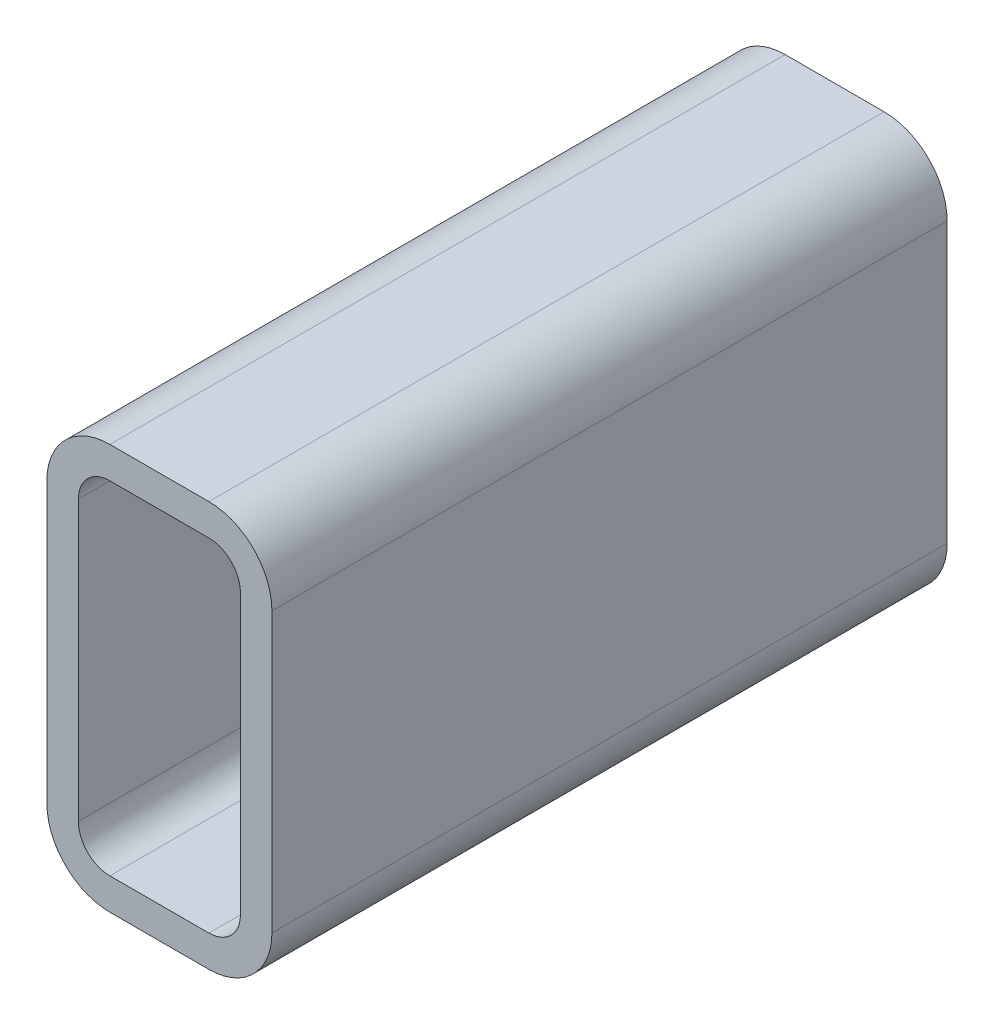
ISO-10303-21;
HEADER;
FILE_DESCRIPTION(('STEP AP214'),'2;1');
FILE_NAME('part.step','',(''),(''),'','','');
FILE_SCHEMA(('AUTOMOTIVE_DESIGN { 1 0 10303 214 1 1 1 1 }'));
ENDSEC;
DATA;
#1=APPLICATION_CONTEXT('core data for automotive mechanical design processes');
#2=APPLICATION_PROTOCOL_DEFINITION('international standard','automotive_design',2000,#1);
#3=PRODUCT_CONTEXT('',#1,'mechanical');
#4=PRODUCT('Part','Part','',(#3));
#5=PRODUCT_RELATED_PRODUCT_CATEGORY('part','',(#4));
#6=PRODUCT_DEFINITION_FORMATION('','',#4);
#7=PRODUCT_DEFINITION_CONTEXT('part definition',#1,'design');
#8=PRODUCT_DEFINITION('design','',#6,#7);
#9=PRODUCT_DEFINITION_SHAPE('','',#8);
#10=(LENGTH_UNIT() NAMED_UNIT(*) SI_UNIT(.MILLI.,.METRE.));
#11=(NAMED_UNIT(*) PLANE_ANGLE_UNIT() SI_UNIT($,.RADIAN.));
#12=(NAMED_UNIT(*) SI_UNIT($,.STERADIAN.) SOLID_ANGLE_UNIT());
#13=UNCERTAINTY_MEASURE_WITH_UNIT(LENGTH_MEASURE(1.E-05),#10,'distance_accuracy_value','');
#14=(GEOMETRIC_REPRESENTATION_CONTEXT(3) GLOBAL_UNCERTAINTY_ASSIGNED_CONTEXT((#13)) GLOBAL_UNIT_ASSIGNED_CONTEXT((#10,
#11,#12)) REPRESENTATION_CONTEXT('',''));
#15=CARTESIAN_POINT('',(0.,0.,0.));
#16=DIRECTION('',(0.,0.,1.));
#17=DIRECTION('',(1.,0.,0.));
#18=AXIS2_PLACEMENT_3D('',#15,#16,#17);
#19=CARTESIAN_POINT('',(-50.,-90.,300.));
#20=DIRECTION('',(0.,0.,1.));
#21=DIRECTION('',(1.,0.,0.));
#22=AXIS2_PLACEMENT_3D('',#19,#20,#21);
#23=PLANE('',#22);
#24=DIRECTION('',(0.,-1.,0.));
#25=VECTOR('',#24,1.);
#26=CARTESIAN_POINT('',(-50.,90.,300.));
#27=LINE('',#26,#25);
#28=CARTESIAN_POINT('',(-50.,62.,300.));
#29=VERTEX_POINT('',#28);
#30=CARTESIAN_POINT('',(-50.,-61.9999999999999,300.));
#31=VERTEX_POINT('',#30);
#32=EDGE_CURVE('E247',#29,#31,#27,.T.);
#33=ORIENTED_EDGE('',*,*,#32,.T.);
#34=CARTESIAN_POINT('',(-22.,-62.,300.));
#35=DIRECTION('',(0.,0.,1.));
#36=DIRECTION('',(1.,0.,0.));
#37=AXIS2_PLACEMENT_3D('',#34,#35,#36);
#38=CIRCLE('',#37,28.);
#39=CARTESIAN_POINT('',(-22.,-90.,300.));
#40=VERTEX_POINT('',#39);
#41=EDGE_CURVE('E231',#31,#40,#38,.T.);
#42=ORIENTED_EDGE('',*,*,#41,.T.);
#43=DIRECTION('',(1.,0.,0.));
#44=VECTOR('',#43,1.);
#45=CARTESIAN_POINT('',(-50.,-90.,300.));
#46=LINE('',#45,#44);
#47=CARTESIAN_POINT('',(22.,-90.,300.));
#48=VERTEX_POINT('',#47);
#49=EDGE_CURVE('E250',#40,#48,#46,.T.);
#50=ORIENTED_EDGE('',*,*,#49,.T.);
#51=CARTESIAN_POINT('',(22.,-62.,300.));
#52=DIRECTION('',(0.,0.,1.));
#53=DIRECTION('',(1.,0.,0.));
#54=AXIS2_PLACEMENT_3D('',#51,#52,#53);
#55=CIRCLE('',#54,28.);
#56=CARTESIAN_POINT('',(50.,-61.9999999999999,300.));
#57=VERTEX_POINT('',#56);
#58=EDGE_CURVE('E229',#48,#57,#55,.T.);
#59=ORIENTED_EDGE('',*,*,#58,.T.);
#60=DIRECTION('',(0.,1.,0.));
#61=VECTOR('',#60,1.);
#62=CARTESIAN_POINT('',(50.,90.,300.));
#63=LINE('',#62,#61);
#64=CARTESIAN_POINT('',(50.,62.,300.));
#65=VERTEX_POINT('',#64);
#66=EDGE_CURVE('E177',#57,#65,#63,.T.);
#67=ORIENTED_EDGE('',*,*,#66,.T.);
#68=CARTESIAN_POINT('',(22.,62.,300.));
#69=DIRECTION('',(0.,0.,1.));
#70=DIRECTION('',(1.,0.,0.));
#71=AXIS2_PLACEMENT_3D('',#68,#69,#70);
#72=CIRCLE('',#71,28.);
#73=CARTESIAN_POINT('',(22.,90.,300.));
#74=VERTEX_POINT('',#73);
#75=EDGE_CURVE('E55',#65,#74,#72,.T.);
#76=ORIENTED_EDGE('',*,*,#75,.T.);
#77=DIRECTION('',(-1.,0.,0.));
#78=VECTOR('',#77,1.);
#79=CARTESIAN_POINT('',(-50.,90.,300.));
#80=LINE('',#79,#78);
#81=CARTESIAN_POINT('',(-22.,90.,300.));
#82=VERTEX_POINT('',#81);
#83=EDGE_CURVE('E173',#74,#82,#80,.T.);
#84=ORIENTED_EDGE('',*,*,#83,.T.);
#85=CARTESIAN_POINT('',(-22.,62.,300.));
#86=DIRECTION('',(0.,0.,1.));
#87=DIRECTION('',(1.,0.,0.));
#88=AXIS2_PLACEMENT_3D('',#85,#86,#87);
#89=CIRCLE('',#88,28.);
#90=EDGE_CURVE('E227',#82,#29,#89,.T.);
#91=ORIENTED_EDGE('',*,*,#90,.T.);
#92=EDGE_LOOP('',(#33,#42,#50,#59,#67,#76,#84,#91));
#93=FACE_BOUND('',#92,.T.);
#94=DIRECTION('',(1.,0.,0.));
#95=VECTOR('',#94,1.);
#96=CARTESIAN_POINT('',(-36.,-76.,300.));
#97=LINE('',#96,#95);
#98=CARTESIAN_POINT('',(-22.,-76.,300.));
#99=VERTEX_POINT('',#98);
#100=CARTESIAN_POINT('',(22.,-76.,300.));
#101=VERTEX_POINT('',#100);
#102=EDGE_CURVE('E277',#99,#101,#97,.T.);
#103=ORIENTED_EDGE('',*,*,#102,.F.);
#104=CARTESIAN_POINT('',(-22.,-62.,300.));
#105=DIRECTION('',(0.,0.,1.));
#106=DIRECTION('',(1.,0.,0.));
#107=AXIS2_PLACEMENT_3D('',#104,#105,#106);
#108=CIRCLE('',#107,14.);
#109=CARTESIAN_POINT('',(-36.,-62.,300.));
#110=VERTEX_POINT('',#109);
#111=EDGE_CURVE('E159',#99,#110,#108,.F.);
#112=ORIENTED_EDGE('',*,*,#111,.T.);
#113=DIRECTION('',(0.,-1.,0.));
#114=VECTOR('',#113,1.);
#115=CARTESIAN_POINT('',(-36.,76.,300.));
#116=LINE('',#115,#114);
#117=CARTESIAN_POINT('',(-36.,62.,300.));
#118=VERTEX_POINT('',#117);
#119=EDGE_CURVE('E266',#118,#110,#116,.T.);
#120=ORIENTED_EDGE('',*,*,#119,.F.);
#121=CARTESIAN_POINT('',(-22.,62.,300.));
#122=DIRECTION('',(0.,0.,1.));
#123=DIRECTION('',(1.,0.,0.));
#124=AXIS2_PLACEMENT_3D('',#121,#122,#123);
#125=CIRCLE('',#124,14.);
#126=CARTESIAN_POINT('',(-22.,76.,300.));
#127=VERTEX_POINT('',#126);
#128=EDGE_CURVE('E158',#118,#127,#125,.F.);
#129=ORIENTED_EDGE('',*,*,#128,.T.);
#130=DIRECTION('',(-1.,0.,0.));
#131=VECTOR('',#130,1.);
#132=CARTESIAN_POINT('',(-36.,76.,300.));
#133=LINE('',#132,#131);
#134=CARTESIAN_POINT('',(22.,76.,300.));
#135=VERTEX_POINT('',#134);
#136=EDGE_CURVE('E260',#135,#127,#133,.T.);
#137=ORIENTED_EDGE('',*,*,#136,.F.);
#138=CARTESIAN_POINT('',(22.,62.,300.));
#139=DIRECTION('',(0.,0.,1.));
#140=DIRECTION('',(1.,0.,0.));
#141=AXIS2_PLACEMENT_3D('',#138,#139,#140);
#142=CIRCLE('',#141,14.);
#143=CARTESIAN_POINT('',(36.,62.,300.));
#144=VERTEX_POINT('',#143);
#145=EDGE_CURVE('E202',#135,#144,#142,.F.);
#146=ORIENTED_EDGE('',*,*,#145,.T.);
#147=DIRECTION('',(0.,1.,0.));
#148=VECTOR('',#147,1.);
#149=CARTESIAN_POINT('',(36.,76.,300.));
#150=LINE('',#149,#148);
#151=CARTESIAN_POINT('',(36.,-62.,300.));
#152=VERTEX_POINT('',#151);
#153=EDGE_CURVE('E274',#152,#144,#150,.T.);
#154=ORIENTED_EDGE('',*,*,#153,.F.);
#155=CARTESIAN_POINT('',(22.,-62.,300.));
#156=DIRECTION('',(0.,0.,1.));
#157=DIRECTION('',(1.,0.,0.));
#158=AXIS2_PLACEMENT_3D('',#155,#156,#157);
#159=CIRCLE('',#158,14.);
#160=EDGE_CURVE('E206',#152,#101,#159,.F.);
#161=ORIENTED_EDGE('',*,*,#160,.T.);
#162=EDGE_LOOP('',(#103,#112,#120,#129,#137,#146,#154,#161));
#163=FACE_BOUND('',#162,.T.);
#164=ADVANCED_FACE('F35',(#93,#163),#23,.T.);
#165=CARTESIAN_POINT('',(-50.,-90.,0.));
#166=DIRECTION('',(0.,0.,1.));
#167=DIRECTION('',(1.,0.,0.));
#168=AXIS2_PLACEMENT_3D('',#165,#166,#167);
#169=PLANE('',#168);
#170=DIRECTION('',(1.,0.,0.));
#171=VECTOR('',#170,1.);
#172=CARTESIAN_POINT('',(-50.,-90.,0.));
#173=LINE('',#172,#171);
#174=CARTESIAN_POINT('',(-22.,-90.,0.));
#175=VERTEX_POINT('',#174);
#176=CARTESIAN_POINT('',(22.,-90.,0.));
#177=VERTEX_POINT('',#176);
#178=EDGE_CURVE('E252',#175,#177,#173,.T.);
#179=ORIENTED_EDGE('',*,*,#178,.F.);
#180=CARTESIAN_POINT('',(-22.,-62.,0.));
#181=DIRECTION('',(0.,0.,1.));
#182=DIRECTION('',(1.,0.,0.));
#183=AXIS2_PLACEMENT_3D('',#180,#181,#182);
#184=CIRCLE('',#183,28.);
#185=CARTESIAN_POINT('',(-50.,-61.9999999999999,0.));
#186=VERTEX_POINT('',#185);
#187=EDGE_CURVE('E219',#175,#186,#184,.F.);
#188=ORIENTED_EDGE('',*,*,#187,.T.);
#189=DIRECTION('',(0.,-1.,0.));
#190=VECTOR('',#189,1.);
#191=CARTESIAN_POINT('',(-50.,90.,0.));
#192=LINE('',#191,#190);
#193=CARTESIAN_POINT('',(-50.,62.,0.));
#194=VERTEX_POINT('',#193);
#195=EDGE_CURVE('E256',#194,#186,#192,.T.);
#196=ORIENTED_EDGE('',*,*,#195,.F.);
#197=CARTESIAN_POINT('',(-22.,62.,0.));
#198=DIRECTION('',(0.,0.,1.));
#199=DIRECTION('',(1.,0.,0.));
#200=AXIS2_PLACEMENT_3D('',#197,#198,#199);
#201=CIRCLE('',#200,28.);
#202=CARTESIAN_POINT('',(-22.,90.,0.));
#203=VERTEX_POINT('',#202);
#204=EDGE_CURVE('E215',#194,#203,#201,.F.);
#205=ORIENTED_EDGE('',*,*,#204,.T.);
#206=DIRECTION('',(-1.,0.,0.));
#207=VECTOR('',#206,1.);
#208=CARTESIAN_POINT('',(-50.,90.,0.));
#209=LINE('',#208,#207);
#210=CARTESIAN_POINT('',(22.,90.,0.));
#211=VERTEX_POINT('',#210);
#212=EDGE_CURVE('E180',#211,#203,#209,.T.);
#213=ORIENTED_EDGE('',*,*,#212,.F.);
#214=CARTESIAN_POINT('',(22.,62.,0.));
#215=DIRECTION('',(0.,0.,1.));
#216=DIRECTION('',(1.,0.,0.));
#217=AXIS2_PLACEMENT_3D('',#214,#215,#216);
#218=CIRCLE('',#217,28.);
#219=CARTESIAN_POINT('',(50.,62.,0.));
#220=VERTEX_POINT('',#219);
#221=EDGE_CURVE('E213',#211,#220,#218,.F.);
#222=ORIENTED_EDGE('',*,*,#221,.T.);
#223=DIRECTION('',(0.,1.,0.));
#224=VECTOR('',#223,1.);
#225=CARTESIAN_POINT('',(50.,90.,0.));
#226=LINE('',#225,#224);
#227=CARTESIAN_POINT('',(50.,-61.9999999999999,0.));
#228=VERTEX_POINT('',#227);
#229=EDGE_CURVE('E248',#228,#220,#226,.T.);
#230=ORIENTED_EDGE('',*,*,#229,.F.);
#231=CARTESIAN_POINT('',(22.,-62.,0.));
#232=DIRECTION('',(0.,0.,1.));
#233=DIRECTION('',(1.,0.,0.));
#234=AXIS2_PLACEMENT_3D('',#231,#232,#233);
#235=CIRCLE('',#234,28.);
#236=EDGE_CURVE('E217',#228,#177,#235,.F.);
#237=ORIENTED_EDGE('',*,*,#236,.T.);
#238=EDGE_LOOP('',(#179,#188,#196,#205,#213,#222,#230,#237));
#239=FACE_BOUND('',#238,.T.);
#240=DIRECTION('',(-1.,0.,0.));
#241=VECTOR('',#240,1.);
#242=CARTESIAN_POINT('',(-36.,76.,0.));
#243=LINE('',#242,#241);
#244=CARTESIAN_POINT('',(22.,76.,0.));
#245=VERTEX_POINT('',#244);
#246=CARTESIAN_POINT('',(-22.,76.,0.));
#247=VERTEX_POINT('',#246);
#248=EDGE_CURVE('E153',#245,#247,#243,.T.);
#249=ORIENTED_EDGE('',*,*,#248,.T.);
#250=CARTESIAN_POINT('',(-22.,62.,0.));
#251=DIRECTION('',(0.,0.,1.));
#252=DIRECTION('',(1.,0.,0.));
#253=AXIS2_PLACEMENT_3D('',#250,#251,#252);
#254=CIRCLE('',#253,14.);
#255=CARTESIAN_POINT('',(-36.,62.,0.));
#256=VERTEX_POINT('',#255);
#257=EDGE_CURVE('E148',#247,#256,#254,.T.);
#258=ORIENTED_EDGE('',*,*,#257,.T.);
#259=DIRECTION('',(0.,-1.,0.));
#260=VECTOR('',#259,1.);
#261=CARTESIAN_POINT('',(-36.,76.,0.));
#262=LINE('',#261,#260);
#263=CARTESIAN_POINT('',(-36.,-62.,0.));
#264=VERTEX_POINT('',#263);
#265=EDGE_CURVE('E151',#256,#264,#262,.T.);
#266=ORIENTED_EDGE('',*,*,#265,.T.);
#267=CARTESIAN_POINT('',(-22.,-62.,0.));
#268=DIRECTION('',(0.,0.,1.));
#269=DIRECTION('',(1.,0.,0.));
#270=AXIS2_PLACEMENT_3D('',#267,#268,#269);
#271=CIRCLE('',#270,14.);
#272=CARTESIAN_POINT('',(-22.,-76.,0.));
#273=VERTEX_POINT('',#272);
#274=EDGE_CURVE('E196',#264,#273,#271,.T.);
#275=ORIENTED_EDGE('',*,*,#274,.T.);
#276=DIRECTION('',(1.,0.,0.));
#277=VECTOR('',#276,1.);
#278=CARTESIAN_POINT('',(-36.,-76.,0.));
#279=LINE('',#278,#277);
#280=CARTESIAN_POINT('',(22.,-76.,0.));
#281=VERTEX_POINT('',#280);
#282=EDGE_CURVE('E169',#273,#281,#279,.T.);
#283=ORIENTED_EDGE('',*,*,#282,.T.);
#284=CARTESIAN_POINT('',(22.,-62.,0.));
#285=DIRECTION('',(0.,0.,1.));
#286=DIRECTION('',(1.,0.,0.));
#287=AXIS2_PLACEMENT_3D('',#284,#285,#286);
#288=CIRCLE('',#287,14.);
#289=CARTESIAN_POINT('',(36.,-62.,0.));
#290=VERTEX_POINT('',#289);
#291=EDGE_CURVE('E204',#281,#290,#288,.T.);
#292=ORIENTED_EDGE('',*,*,#291,.T.);
#293=DIRECTION('',(0.,1.,0.));
#294=VECTOR('',#293,1.);
#295=CARTESIAN_POINT('',(36.,76.,0.));
#296=LINE('',#295,#294);
#297=CARTESIAN_POINT('',(36.,62.,0.));
#298=VERTEX_POINT('',#297);
#299=EDGE_CURVE('E267',#290,#298,#296,.T.);
#300=ORIENTED_EDGE('',*,*,#299,.T.);
#301=CARTESIAN_POINT('',(22.,62.,0.));
#302=DIRECTION('',(0.,0.,1.));
#303=DIRECTION('',(1.,0.,0.));
#304=AXIS2_PLACEMENT_3D('',#301,#302,#303);
#305=CIRCLE('',#304,14.);
#306=EDGE_CURVE('E200',#298,#245,#305,.T.);
#307=ORIENTED_EDGE('',*,*,#306,.T.);
#308=EDGE_LOOP('',(#249,#258,#266,#275,#283,#292,#300,#307));
#309=FACE_BOUND('',#308,.T.);
#310=ADVANCED_FACE('F150',(#239,#309),#169,.F.);
#311=CARTESIAN_POINT('',(-50.,90.,300.));
#312=DIRECTION('',(1.,0.,0.));
#313=DIRECTION('',(0.,1.,0.));
#314=AXIS2_PLACEMENT_3D('',#311,#312,#313);
#315=PLANE('',#314);
#316=ORIENTED_EDGE('',*,*,#195,.T.);
#317=DIRECTION('',(0.,0.,-1.));
#318=VECTOR('',#317,1.);
#319=CARTESIAN_POINT('',(-50.,-62.,300.));
#320=LINE('',#319,#318);
#321=EDGE_CURVE('E224',#186,#31,#320,.F.);
#322=ORIENTED_EDGE('',*,*,#321,.T.);
#323=ORIENTED_EDGE('',*,*,#32,.F.);
#324=DIRECTION('',(0.,0.,-1.));
#325=VECTOR('',#324,1.);
#326=CARTESIAN_POINT('',(-50.,62.,300.));
#327=LINE('',#326,#325);
#328=EDGE_CURVE('E221',#29,#194,#327,.T.);
#329=ORIENTED_EDGE('',*,*,#328,.T.);
#330=EDGE_LOOP('',(#316,#322,#323,#329));
#331=FACE_BOUND('',#330,.T.);
#332=ADVANCED_FACE('F311',(#331),#315,.F.);
#333=CARTESIAN_POINT('',(-50.,-90.,300.));
#334=DIRECTION('',(0.,1.,0.));
#335=DIRECTION('',(0.,0.,1.));
#336=AXIS2_PLACEMENT_3D('',#333,#334,#335);
#337=PLANE('',#336);
#338=ORIENTED_EDGE('',*,*,#49,.F.);
#339=DIRECTION('',(0.,0.,-1.));
#340=VECTOR('',#339,1.);
#341=CARTESIAN_POINT('',(-22.,-90.,300.));
#342=LINE('',#341,#340);
#343=EDGE_CURVE('E210',#40,#175,#342,.T.);
#344=ORIENTED_EDGE('',*,*,#343,.T.);
#345=ORIENTED_EDGE('',*,*,#178,.T.);
#346=DIRECTION('',(0.,0.,-1.));
#347=VECTOR('',#346,1.);
#348=CARTESIAN_POINT('',(22.,-90.,300.));
#349=LINE('',#348,#347);
#350=EDGE_CURVE('E208',#177,#48,#349,.F.);
#351=ORIENTED_EDGE('',*,*,#350,.T.);
#352=EDGE_LOOP('',(#338,#344,#345,#351));
#353=FACE_BOUND('',#352,.T.);
#354=ADVANCED_FACE('F321',(#353),#337,.F.);
#355=CARTESIAN_POINT('',(50.,90.,300.));
#356=DIRECTION('',(-1.,0.,0.));
#357=DIRECTION('',(0.,0.,1.));
#358=AXIS2_PLACEMENT_3D('',#355,#356,#357);
#359=PLANE('',#358);
#360=ORIENTED_EDGE('',*,*,#66,.F.);
#361=DIRECTION('',(0.,0.,-1.));
#362=VECTOR('',#361,1.);
#363=CARTESIAN_POINT('',(50.,-62.,300.));
#364=LINE('',#363,#362);
#365=EDGE_CURVE('E235',#57,#228,#364,.T.);
#366=ORIENTED_EDGE('',*,*,#365,.T.);
#367=ORIENTED_EDGE('',*,*,#229,.T.);
#368=DIRECTION('',(0.,0.,-1.));
#369=VECTOR('',#368,1.);
#370=CARTESIAN_POINT('',(50.,62.,300.));
#371=LINE('',#370,#369);
#372=EDGE_CURVE('E233',#220,#65,#371,.F.);
#373=ORIENTED_EDGE('',*,*,#372,.T.);
#374=EDGE_LOOP('',(#360,#366,#367,#373));
#375=FACE_BOUND('',#374,.T.);
#376=ADVANCED_FACE('F318',(#375),#359,.F.);
#377=CARTESIAN_POINT('',(-50.,90.,300.));
#378=DIRECTION('',(0.,-1.,0.));
#379=DIRECTION('',(0.,0.,-1.));
#380=AXIS2_PLACEMENT_3D('',#377,#378,#379);
#381=PLANE('',#380);
#382=ORIENTED_EDGE('',*,*,#212,.T.);
#383=DIRECTION('',(0.,0.,-1.));
#384=VECTOR('',#383,1.);
#385=CARTESIAN_POINT('',(-22.,90.,300.));
#386=LINE('',#385,#384);
#387=EDGE_CURVE('E11',#203,#82,#386,.F.);
#388=ORIENTED_EDGE('',*,*,#387,.T.);
#389=ORIENTED_EDGE('',*,*,#83,.F.);
#390=DIRECTION('',(0.,0.,-1.));
#391=VECTOR('',#390,1.);
#392=CARTESIAN_POINT('',(22.,90.,300.));
#393=LINE('',#392,#391);
#394=EDGE_CURVE('E43',#74,#211,#393,.T.);
#395=ORIENTED_EDGE('',*,*,#394,.T.);
#396=EDGE_LOOP('',(#382,#388,#389,#395));
#397=FACE_BOUND('',#396,.T.);
#398=ADVANCED_FACE('F240',(#397),#381,.F.);
#399=CARTESIAN_POINT('',(-36.,76.,300.));
#400=DIRECTION('',(1.,0.,0.));
#401=DIRECTION('',(0.,0.,-1.));
#402=AXIS2_PLACEMENT_3D('',#399,#400,#401);
#403=PLANE('',#402);
#404=ORIENTED_EDGE('',*,*,#119,.T.);
#405=DIRECTION('',(0.,0.,-1.));
#406=VECTOR('',#405,1.);
#407=CARTESIAN_POINT('',(-36.,-62.,0.));
#408=LINE('',#407,#406);
#409=EDGE_CURVE('E168',#110,#264,#408,.T.);
#410=ORIENTED_EDGE('',*,*,#409,.T.);
#411=ORIENTED_EDGE('',*,*,#265,.F.);
#412=DIRECTION('',(0.,0.,-1.));
#413=VECTOR('',#412,1.);
#414=CARTESIAN_POINT('',(-36.,62.,300.));
#415=LINE('',#414,#413);
#416=EDGE_CURVE('E165',#256,#118,#415,.F.);
#417=ORIENTED_EDGE('',*,*,#416,.T.);
#418=EDGE_LOOP('',(#404,#410,#411,#417));
#419=FACE_BOUND('',#418,.T.);
#420=ADVANCED_FACE('F164',(#419),#403,.T.);
#421=CARTESIAN_POINT('',(-36.,-76.,300.));
#422=DIRECTION('',(0.,1.,0.));
#423=DIRECTION('',(0.,0.,1.));
#424=AXIS2_PLACEMENT_3D('',#421,#422,#423);
#425=PLANE('',#424);
#426=ORIENTED_EDGE('',*,*,#282,.F.);
#427=DIRECTION('',(0.,0.,-1.));
#428=VECTOR('',#427,1.);
#429=CARTESIAN_POINT('',(-22.,-76.,300.));
#430=LINE('',#429,#428);
#431=EDGE_CURVE('E185',#273,#99,#430,.F.);
#432=ORIENTED_EDGE('',*,*,#431,.T.);
#433=ORIENTED_EDGE('',*,*,#102,.T.);
#434=DIRECTION('',(0.,0.,-1.));
#435=VECTOR('',#434,1.);
#436=CARTESIAN_POINT('',(22.,-76.,0.));
#437=LINE('',#436,#435);
#438=EDGE_CURVE('E175',#101,#281,#437,.T.);
#439=ORIENTED_EDGE('',*,*,#438,.T.);
#440=EDGE_LOOP('',(#426,#432,#433,#439));
#441=FACE_BOUND('',#440,.T.);
#442=ADVANCED_FACE('F287',(#441),#425,.T.);
#443=CARTESIAN_POINT('',(36.,76.,300.));
#444=DIRECTION('',(-1.,0.,0.));
#445=DIRECTION('',(0.,0.,1.));
#446=AXIS2_PLACEMENT_3D('',#443,#444,#445);
#447=PLANE('',#446);
#448=ORIENTED_EDGE('',*,*,#153,.T.);
#449=DIRECTION('',(0.,0.,-1.));
#450=VECTOR('',#449,1.);
#451=CARTESIAN_POINT('',(36.,62.,0.));
#452=LINE('',#451,#450);
#453=EDGE_CURVE('E193',#144,#298,#452,.T.);
#454=ORIENTED_EDGE('',*,*,#453,.T.);
#455=ORIENTED_EDGE('',*,*,#299,.F.);
#456=DIRECTION('',(0.,0.,-1.));
#457=VECTOR('',#456,1.);
#458=CARTESIAN_POINT('',(36.,-62.,300.));
#459=LINE('',#458,#457);
#460=EDGE_CURVE('E191',#290,#152,#459,.F.);
#461=ORIENTED_EDGE('',*,*,#460,.T.);
#462=EDGE_LOOP('',(#448,#454,#455,#461));
#463=FACE_BOUND('',#462,.T.);
#464=ADVANCED_FACE('F296',(#463),#447,.T.);
#465=CARTESIAN_POINT('',(-36.,76.,300.));
#466=DIRECTION('',(0.,-1.,0.));
#467=DIRECTION('',(0.,0.,-1.));
#468=AXIS2_PLACEMENT_3D('',#465,#466,#467);
#469=PLANE('',#468);
#470=ORIENTED_EDGE('',*,*,#136,.T.);
#471=DIRECTION('',(0.,0.,-1.));
#472=VECTOR('',#471,1.);
#473=CARTESIAN_POINT('',(-22.,76.,0.));
#474=LINE('',#473,#472);
#475=EDGE_CURVE('E189',#127,#247,#474,.T.);
#476=ORIENTED_EDGE('',*,*,#475,.T.);
#477=ORIENTED_EDGE('',*,*,#248,.F.);
#478=DIRECTION('',(0.,0.,-1.));
#479=VECTOR('',#478,1.);
#480=CARTESIAN_POINT('',(22.,76.,300.));
#481=LINE('',#480,#479);
#482=EDGE_CURVE('E187',#245,#135,#481,.F.);
#483=ORIENTED_EDGE('',*,*,#482,.T.);
#484=EDGE_LOOP('',(#470,#476,#477,#483));
#485=FACE_BOUND('',#484,.T.);
#486=ADVANCED_FACE('F304',(#485),#469,.T.);
#487=CARTESIAN_POINT('',(-22.,-62.,300.));
#488=DIRECTION('',(0.,0.,1.));
#489=DIRECTION('',(1.,0.,0.));
#490=AXIS2_PLACEMENT_3D('',#487,#488,#489);
#491=CYLINDRICAL_SURFACE('',#490,14.);
#492=ORIENTED_EDGE('',*,*,#111,.F.);
#493=ORIENTED_EDGE('',*,*,#431,.F.);
#494=ORIENTED_EDGE('',*,*,#274,.F.);
#495=ORIENTED_EDGE('',*,*,#409,.F.);
#496=EDGE_LOOP('',(#492,#493,#494,#495));
#497=FACE_BOUND('',#496,.T.);
#498=ADVANCED_FACE('F283',(#497),#491,.F.);
#499=CARTESIAN_POINT('',(-22.,62.,300.));
#500=DIRECTION('',(0.,0.,1.));
#501=DIRECTION('',(1.,0.,0.));
#502=AXIS2_PLACEMENT_3D('',#499,#500,#501);
#503=CYLINDRICAL_SURFACE('',#502,14.);
#504=ORIENTED_EDGE('',*,*,#128,.F.);
#505=ORIENTED_EDGE('',*,*,#416,.F.);
#506=ORIENTED_EDGE('',*,*,#257,.F.);
#507=ORIENTED_EDGE('',*,*,#475,.F.);
#508=EDGE_LOOP('',(#504,#505,#506,#507));
#509=FACE_BOUND('',#508,.T.);
#510=ADVANCED_FACE('F172',(#509),#503,.F.);
#511=CARTESIAN_POINT('',(22.,62.,300.));
#512=DIRECTION('',(0.,0.,1.));
#513=DIRECTION('',(1.,0.,0.));
#514=AXIS2_PLACEMENT_3D('',#511,#512,#513);
#515=CYLINDRICAL_SURFACE('',#514,14.);
#516=ORIENTED_EDGE('',*,*,#145,.F.);
#517=ORIENTED_EDGE('',*,*,#482,.F.);
#518=ORIENTED_EDGE('',*,*,#306,.F.);
#519=ORIENTED_EDGE('',*,*,#453,.F.);
#520=EDGE_LOOP('',(#516,#517,#518,#519));
#521=FACE_BOUND('',#520,.T.);
#522=ADVANCED_FACE('F301',(#521),#515,.F.);
#523=CARTESIAN_POINT('',(22.,-62.,300.));
#524=DIRECTION('',(0.,0.,1.));
#525=DIRECTION('',(1.,0.,0.));
#526=AXIS2_PLACEMENT_3D('',#523,#524,#525);
#527=CYLINDRICAL_SURFACE('',#526,14.);
#528=ORIENTED_EDGE('',*,*,#160,.F.);
#529=ORIENTED_EDGE('',*,*,#460,.F.);
#530=ORIENTED_EDGE('',*,*,#291,.F.);
#531=ORIENTED_EDGE('',*,*,#438,.F.);
#532=EDGE_LOOP('',(#528,#529,#530,#531));
#533=FACE_BOUND('',#532,.T.);
#534=ADVANCED_FACE('F292',(#533),#527,.F.);
#535=CARTESIAN_POINT('',(-22.,-62.,300.));
#536=DIRECTION('',(0.,0.,-1.));
#537=DIRECTION('',(-1.,0.,0.));
#538=AXIS2_PLACEMENT_3D('',#535,#536,#537);
#539=CYLINDRICAL_SURFACE('',#538,28.);
#540=ORIENTED_EDGE('',*,*,#41,.F.);
#541=ORIENTED_EDGE('',*,*,#321,.F.);
#542=ORIENTED_EDGE('',*,*,#187,.F.);
#543=ORIENTED_EDGE('',*,*,#343,.F.);
#544=EDGE_LOOP('',(#540,#541,#542,#543));
#545=FACE_BOUND('',#544,.T.);
#546=ADVANCED_FACE('F336',(#545),#539,.T.);
#547=CARTESIAN_POINT('',(22.,-62.,300.));
#548=DIRECTION('',(0.,0.,-1.));
#549=DIRECTION('',(-1.,0.,0.));
#550=AXIS2_PLACEMENT_3D('',#547,#548,#549);
#551=CYLINDRICAL_SURFACE('',#550,28.);
#552=ORIENTED_EDGE('',*,*,#58,.F.);
#553=ORIENTED_EDGE('',*,*,#350,.F.);
#554=ORIENTED_EDGE('',*,*,#236,.F.);
#555=ORIENTED_EDGE('',*,*,#365,.F.);
#556=EDGE_LOOP('',(#552,#553,#554,#555));
#557=FACE_BOUND('',#556,.T.);
#558=ADVANCED_FACE('F339',(#557),#551,.T.);
#559=CARTESIAN_POINT('',(-22.,62.,300.));
#560=DIRECTION('',(0.,0.,-1.));
#561=DIRECTION('',(-1.,0.,0.));
#562=AXIS2_PLACEMENT_3D('',#559,#560,#561);
#563=CYLINDRICAL_SURFACE('',#562,28.);
#564=ORIENTED_EDGE('',*,*,#90,.F.);
#565=ORIENTED_EDGE('',*,*,#387,.F.);
#566=ORIENTED_EDGE('',*,*,#204,.F.);
#567=ORIENTED_EDGE('',*,*,#328,.F.);
#568=EDGE_LOOP('',(#564,#565,#566,#567));
#569=FACE_BOUND('',#568,.T.);
#570=ADVANCED_FACE('F342',(#569),#563,.T.);
#571=CARTESIAN_POINT('',(22.,62.,300.));
#572=DIRECTION('',(0.,0.,-1.));
#573=DIRECTION('',(-1.,0.,0.));
#574=AXIS2_PLACEMENT_3D('',#571,#572,#573);
#575=CYLINDRICAL_SURFACE('',#574,28.);
#576=ORIENTED_EDGE('',*,*,#75,.F.);
#577=ORIENTED_EDGE('',*,*,#372,.F.);
#578=ORIENTED_EDGE('',*,*,#221,.F.);
#579=ORIENTED_EDGE('',*,*,#394,.F.);
#580=EDGE_LOOP('',(#576,#577,#578,#579));
#581=FACE_BOUND('',#580,.T.);
#582=ADVANCED_FACE('F37',(#581),#575,.T.);
#583=CLOSED_SHELL('',(#164,#310,#332,#354,#376,#398,#420,#442,#464,#486,#498,#510,#522,#534,
#546,#558,#570,#582));
#584=MANIFOLD_SOLID_BREP('B2',#583);
#585=ADVANCED_BREP_SHAPE_REPRESENTATION('',(#18,#584),#14);
#586=SHAPE_DEFINITION_REPRESENTATION(#9,#585);
ENDSEC;
END-ISO-10303-21;
